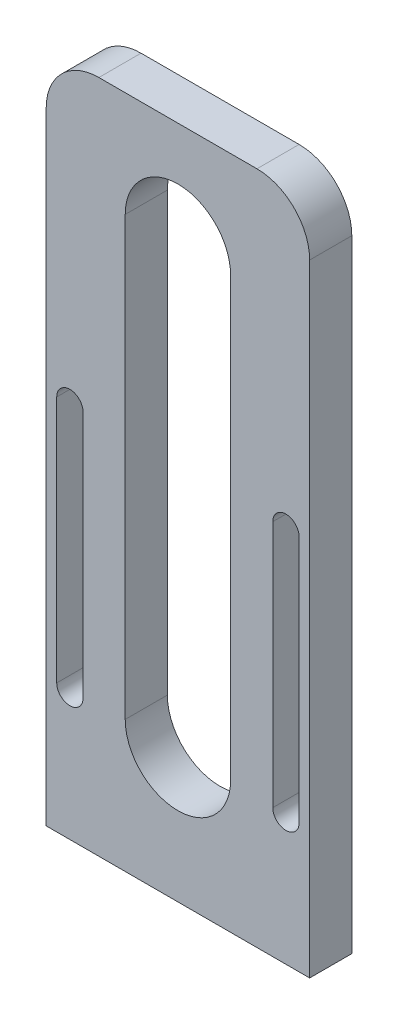
ISO-10303-21;
HEADER;
FILE_DESCRIPTION(('STEP AP214'),'2;1');
FILE_NAME('part.step','',(''),(''),'','','');
FILE_SCHEMA(('AUTOMOTIVE_DESIGN { 1 0 10303 214 1 1 1 1 }'));
ENDSEC;
DATA;
#1=APPLICATION_CONTEXT('core data for automotive mechanical design processes');
#2=APPLICATION_PROTOCOL_DEFINITION('international standard','automotive_design',2000,#1);
#3=PRODUCT_CONTEXT('',#1,'mechanical');
#4=PRODUCT('Part','Part','',(#3));
#5=PRODUCT_RELATED_PRODUCT_CATEGORY('part','',(#4));
#6=PRODUCT_DEFINITION_FORMATION('','',#4);
#7=PRODUCT_DEFINITION_CONTEXT('part definition',#1,'design');
#8=PRODUCT_DEFINITION('design','',#6,#7);
#9=PRODUCT_DEFINITION_SHAPE('','',#8);
#10=(LENGTH_UNIT() NAMED_UNIT(*) SI_UNIT(.MILLI.,.METRE.));
#11=(NAMED_UNIT(*) PLANE_ANGLE_UNIT() SI_UNIT($,.RADIAN.));
#12=(NAMED_UNIT(*) SI_UNIT($,.STERADIAN.) SOLID_ANGLE_UNIT());
#13=UNCERTAINTY_MEASURE_WITH_UNIT(LENGTH_MEASURE(1.E-05),#10,'distance_accuracy_value','');
#14=(GEOMETRIC_REPRESENTATION_CONTEXT(3) GLOBAL_UNCERTAINTY_ASSIGNED_CONTEXT((#13)) GLOBAL_UNIT_ASSIGNED_CONTEXT((#10,
#11,#12)) REPRESENTATION_CONTEXT('',''));
#15=CARTESIAN_POINT('',(0.,0.,0.));
#16=DIRECTION('',(0.,0.,1.));
#17=DIRECTION('',(1.,0.,0.));
#18=AXIS2_PLACEMENT_3D('',#15,#16,#17);
#19=CARTESIAN_POINT('',(-7.5,59.,4.));
#20=DIRECTION('',(0.,0.,-1.));
#21=DIRECTION('',(-1.,0.,0.));
#22=AXIS2_PLACEMENT_3D('',#19,#20,#21);
#23=PLANE('',#22);
#24=CARTESIAN_POINT('',(-10.25,35.75,4.));
#25=DIRECTION('',(0.,0.,1.));
#26=DIRECTION('',(1.,0.,0.));
#27=AXIS2_PLACEMENT_3D('',#24,#25,#26);
#28=CIRCLE('',#27,1.25);
#29=CARTESIAN_POINT('',(-9.,35.75,4.));
#30=VERTEX_POINT('',#29);
#31=CARTESIAN_POINT('',(-11.5,35.75,4.));
#32=VERTEX_POINT('',#31);
#33=EDGE_CURVE('E195',#30,#32,#28,.T.);
#34=ORIENTED_EDGE('',*,*,#33,.F.);
#35=DIRECTION('',(0.,1.,0.));
#36=VECTOR('',#35,1.);
#37=CARTESIAN_POINT('',(-9.,35.75,4.));
#38=LINE('',#37,#36);
#39=CARTESIAN_POINT('',(-8.99999999999999,12.25,4.));
#40=VERTEX_POINT('',#39);
#41=EDGE_CURVE('E203',#40,#30,#38,.T.);
#42=ORIENTED_EDGE('',*,*,#41,.F.);
#43=CARTESIAN_POINT('',(-10.25,12.25,4.));
#44=DIRECTION('',(0.,0.,1.));
#45=DIRECTION('',(1.,0.,0.));
#46=AXIS2_PLACEMENT_3D('',#43,#44,#45);
#47=CIRCLE('',#46,1.25);
#48=CARTESIAN_POINT('',(-11.5,12.25,4.));
#49=VERTEX_POINT('',#48);
#50=EDGE_CURVE('E200',#49,#40,#47,.T.);
#51=ORIENTED_EDGE('',*,*,#50,.F.);
#52=DIRECTION('',(0.,-1.,0.));
#53=VECTOR('',#52,1.);
#54=CARTESIAN_POINT('',(-11.5,35.75,4.));
#55=LINE('',#54,#53);
#56=EDGE_CURVE('E197',#32,#49,#55,.T.);
#57=ORIENTED_EDGE('',*,*,#56,.F.);
#58=EDGE_LOOP('',(#34,#42,#51,#57));
#59=FACE_BOUND('',#58,.T.);
#60=DIRECTION('',(0.,-1.,0.));
#61=VECTOR('',#60,1.);
#62=CARTESIAN_POINT('',(-12.5,0.,4.));
#63=LINE('',#62,#61);
#64=CARTESIAN_POINT('',(-12.5,59.,4.));
#65=VERTEX_POINT('',#64);
#66=CARTESIAN_POINT('',(-12.5,0.,4.));
#67=VERTEX_POINT('',#66);
#68=EDGE_CURVE('E257',#65,#67,#63,.T.);
#69=ORIENTED_EDGE('',*,*,#68,.T.);
#70=DIRECTION('',(1.,0.,0.));
#71=VECTOR('',#70,1.);
#72=CARTESIAN_POINT('',(-12.5,0.,4.));
#73=LINE('',#72,#71);
#74=CARTESIAN_POINT('',(12.5,0.,4.));
#75=VERTEX_POINT('',#74);
#76=EDGE_CURVE('E260',#67,#75,#73,.T.);
#77=ORIENTED_EDGE('',*,*,#76,.T.);
#78=DIRECTION('',(0.,1.,0.));
#79=VECTOR('',#78,1.);
#80=CARTESIAN_POINT('',(12.5,0.,4.));
#81=LINE('',#80,#79);
#82=CARTESIAN_POINT('',(12.5,59.,4.));
#83=VERTEX_POINT('',#82);
#84=EDGE_CURVE('E263',#75,#83,#81,.T.);
#85=ORIENTED_EDGE('',*,*,#84,.T.);
#86=CARTESIAN_POINT('',(7.5,59.,4.));
#87=DIRECTION('',(0.,0.,1.));
#88=DIRECTION('',(-1.,0.,0.));
#89=AXIS2_PLACEMENT_3D('',#86,#87,#88);
#90=CIRCLE('',#89,5.);
#91=CARTESIAN_POINT('',(7.49999999999997,64.,4.));
#92=VERTEX_POINT('',#91);
#93=EDGE_CURVE('E265',#83,#92,#90,.T.);
#94=ORIENTED_EDGE('',*,*,#93,.T.);
#95=DIRECTION('',(-1.,0.,0.));
#96=VECTOR('',#95,1.);
#97=CARTESIAN_POINT('',(-7.49999999999997,64.,4.));
#98=LINE('',#97,#96);
#99=CARTESIAN_POINT('',(-7.49999999999997,64.,4.));
#100=VERTEX_POINT('',#99);
#101=EDGE_CURVE('E267',#92,#100,#98,.T.);
#102=ORIENTED_EDGE('',*,*,#101,.T.);
#103=CARTESIAN_POINT('',(-7.5,59.,4.));
#104=DIRECTION('',(0.,0.,1.));
#105=DIRECTION('',(-1.,0.,0.));
#106=AXIS2_PLACEMENT_3D('',#103,#104,#105);
#107=CIRCLE('',#106,5.);
#108=EDGE_CURVE('E269',#100,#65,#107,.T.);
#109=ORIENTED_EDGE('',*,*,#108,.T.);
#110=EDGE_LOOP('',(#69,#77,#85,#94,#102,#109));
#111=FACE_BOUND('',#110,.T.);
#112=CARTESIAN_POINT('',(0.,54.,4.));
#113=DIRECTION('',(0.,0.,1.));
#114=DIRECTION('',(1.,0.,0.));
#115=AXIS2_PLACEMENT_3D('',#112,#113,#114);
#116=CIRCLE('',#115,5.);
#117=CARTESIAN_POINT('',(5.,54.,4.));
#118=VERTEX_POINT('',#117);
#119=CARTESIAN_POINT('',(-5.,54.,4.));
#120=VERTEX_POINT('',#119);
#121=EDGE_CURVE('E226',#118,#120,#116,.T.);
#122=ORIENTED_EDGE('',*,*,#121,.F.);
#123=DIRECTION('',(0.,1.,0.));
#124=VECTOR('',#123,1.);
#125=CARTESIAN_POINT('',(5.,54.,4.));
#126=LINE('',#125,#124);
#127=CARTESIAN_POINT('',(4.99999999999999,12.5,4.));
#128=VERTEX_POINT('',#127);
#129=EDGE_CURVE('E234',#128,#118,#126,.T.);
#130=ORIENTED_EDGE('',*,*,#129,.F.);
#131=CARTESIAN_POINT('',(0.,12.5,4.));
#132=DIRECTION('',(0.,0.,1.));
#133=DIRECTION('',(1.,0.,0.));
#134=AXIS2_PLACEMENT_3D('',#131,#132,#133);
#135=CIRCLE('',#134,4.99999999999999);
#136=CARTESIAN_POINT('',(-4.99999999999999,12.5,4.));
#137=VERTEX_POINT('',#136);
#138=EDGE_CURVE('E231',#137,#128,#135,.T.);
#139=ORIENTED_EDGE('',*,*,#138,.F.);
#140=DIRECTION('',(0.,-1.,0.));
#141=VECTOR('',#140,1.);
#142=CARTESIAN_POINT('',(-5.,54.,4.));
#143=LINE('',#142,#141);
#144=EDGE_CURVE('E228',#120,#137,#143,.T.);
#145=ORIENTED_EDGE('',*,*,#144,.F.);
#146=EDGE_LOOP('',(#122,#130,#139,#145));
#147=FACE_BOUND('',#146,.T.);
#148=CARTESIAN_POINT('',(10.25,35.75,4.));
#149=DIRECTION('',(0.,0.,1.));
#150=DIRECTION('',(-1.,0.,0.));
#151=AXIS2_PLACEMENT_3D('',#148,#149,#150);
#152=CIRCLE('',#151,1.25);
#153=CARTESIAN_POINT('',(11.5,35.75,4.));
#154=VERTEX_POINT('',#153);
#155=CARTESIAN_POINT('',(9.,35.75,4.));
#156=VERTEX_POINT('',#155);
#157=EDGE_CURVE('E159',#154,#156,#152,.T.);
#158=ORIENTED_EDGE('',*,*,#157,.F.);
#159=DIRECTION('',(0.,1.,0.));
#160=VECTOR('',#159,1.);
#161=CARTESIAN_POINT('',(11.5,35.75,4.));
#162=LINE('',#161,#160);
#163=CARTESIAN_POINT('',(11.5,12.25,4.));
#164=VERTEX_POINT('',#163);
#165=EDGE_CURVE('E181',#164,#154,#162,.T.);
#166=ORIENTED_EDGE('',*,*,#165,.F.);
#167=CARTESIAN_POINT('',(10.25,12.25,4.));
#168=DIRECTION('',(0.,0.,1.));
#169=DIRECTION('',(-1.,0.,0.));
#170=AXIS2_PLACEMENT_3D('',#167,#168,#169);
#171=CIRCLE('',#170,1.25);
#172=CARTESIAN_POINT('',(8.99999999999999,12.25,4.));
#173=VERTEX_POINT('',#172);
#174=EDGE_CURVE('E179',#173,#164,#171,.T.);
#175=ORIENTED_EDGE('',*,*,#174,.F.);
#176=DIRECTION('',(0.,-1.,0.));
#177=VECTOR('',#176,1.);
#178=CARTESIAN_POINT('',(9.,35.75,4.));
#179=LINE('',#178,#177);
#180=EDGE_CURVE('E167',#156,#173,#179,.T.);
#181=ORIENTED_EDGE('',*,*,#180,.F.);
#182=EDGE_LOOP('',(#158,#166,#175,#181));
#183=FACE_BOUND('',#182,.T.);
#184=ADVANCED_FACE('F34',(#59,#111,#147,#183),#23,.F.);
#185=CARTESIAN_POINT('',(-7.5,59.,0.));
#186=DIRECTION('',(0.,0.,-1.));
#187=DIRECTION('',(-1.,0.,0.));
#188=AXIS2_PLACEMENT_3D('',#185,#186,#187);
#189=PLANE('',#188);
#190=DIRECTION('',(0.,-1.,0.));
#191=VECTOR('',#190,1.);
#192=CARTESIAN_POINT('',(-12.5,0.,0.));
#193=LINE('',#192,#191);
#194=CARTESIAN_POINT('',(-12.5,59.,0.));
#195=VERTEX_POINT('',#194);
#196=CARTESIAN_POINT('',(-12.5,0.,0.));
#197=VERTEX_POINT('',#196);
#198=EDGE_CURVE('E256',#195,#197,#193,.T.);
#199=ORIENTED_EDGE('',*,*,#198,.F.);
#200=CARTESIAN_POINT('',(-7.5,59.,0.));
#201=DIRECTION('',(0.,0.,1.));
#202=DIRECTION('',(-1.,0.,0.));
#203=AXIS2_PLACEMENT_3D('',#200,#201,#202);
#204=CIRCLE('',#203,5.);
#205=CARTESIAN_POINT('',(-7.49999999999997,64.,0.));
#206=VERTEX_POINT('',#205);
#207=EDGE_CURVE('E261',#206,#195,#204,.T.);
#208=ORIENTED_EDGE('',*,*,#207,.F.);
#209=DIRECTION('',(-1.,0.,0.));
#210=VECTOR('',#209,1.);
#211=CARTESIAN_POINT('',(-7.49999999999997,64.,0.));
#212=LINE('',#211,#210);
#213=CARTESIAN_POINT('',(7.49999999999997,64.,0.));
#214=VERTEX_POINT('',#213);
#215=EDGE_CURVE('E280',#214,#206,#212,.T.);
#216=ORIENTED_EDGE('',*,*,#215,.F.);
#217=CARTESIAN_POINT('',(7.5,59.,0.));
#218=DIRECTION('',(0.,0.,1.));
#219=DIRECTION('',(-1.,0.,0.));
#220=AXIS2_PLACEMENT_3D('',#217,#218,#219);
#221=CIRCLE('',#220,5.);
#222=CARTESIAN_POINT('',(12.5,59.,0.));
#223=VERTEX_POINT('',#222);
#224=EDGE_CURVE('E278',#223,#214,#221,.T.);
#225=ORIENTED_EDGE('',*,*,#224,.F.);
#226=DIRECTION('',(0.,1.,0.));
#227=VECTOR('',#226,1.);
#228=CARTESIAN_POINT('',(12.5,0.,0.));
#229=LINE('',#228,#227);
#230=CARTESIAN_POINT('',(12.5,0.,0.));
#231=VERTEX_POINT('',#230);
#232=EDGE_CURVE('E276',#231,#223,#229,.T.);
#233=ORIENTED_EDGE('',*,*,#232,.F.);
#234=DIRECTION('',(1.,0.,0.));
#235=VECTOR('',#234,1.);
#236=CARTESIAN_POINT('',(-12.5,0.,0.));
#237=LINE('',#236,#235);
#238=EDGE_CURVE('E274',#197,#231,#237,.T.);
#239=ORIENTED_EDGE('',*,*,#238,.F.);
#240=EDGE_LOOP('',(#199,#208,#216,#225,#233,#239));
#241=FACE_BOUND('',#240,.T.);
#242=DIRECTION('',(0.,1.,0.));
#243=VECTOR('',#242,1.);
#244=CARTESIAN_POINT('',(5.,54.,0.));
#245=LINE('',#244,#243);
#246=CARTESIAN_POINT('',(4.99999999999999,12.5,0.));
#247=VERTEX_POINT('',#246);
#248=CARTESIAN_POINT('',(5.,54.,0.));
#249=VERTEX_POINT('',#248);
#250=EDGE_CURVE('E229',#247,#249,#245,.T.);
#251=ORIENTED_EDGE('',*,*,#250,.T.);
#252=CARTESIAN_POINT('',(0.,54.,0.));
#253=DIRECTION('',(0.,0.,1.));
#254=DIRECTION('',(1.,0.,0.));
#255=AXIS2_PLACEMENT_3D('',#252,#253,#254);
#256=CIRCLE('',#255,5.);
#257=CARTESIAN_POINT('',(-5.,54.,0.));
#258=VERTEX_POINT('',#257);
#259=EDGE_CURVE('E225',#249,#258,#256,.T.);
#260=ORIENTED_EDGE('',*,*,#259,.T.);
#261=DIRECTION('',(0.,-1.,0.));
#262=VECTOR('',#261,1.);
#263=CARTESIAN_POINT('',(-5.,54.,0.));
#264=LINE('',#263,#262);
#265=CARTESIAN_POINT('',(-4.99999999999999,12.5,0.));
#266=VERTEX_POINT('',#265);
#267=EDGE_CURVE('E239',#258,#266,#264,.T.);
#268=ORIENTED_EDGE('',*,*,#267,.T.);
#269=CARTESIAN_POINT('',(0.,12.5,0.));
#270=DIRECTION('',(0.,0.,1.));
#271=DIRECTION('',(1.,0.,0.));
#272=AXIS2_PLACEMENT_3D('',#269,#270,#271);
#273=CIRCLE('',#272,4.99999999999999);
#274=EDGE_CURVE('E242',#266,#247,#273,.T.);
#275=ORIENTED_EDGE('',*,*,#274,.T.);
#276=EDGE_LOOP('',(#251,#260,#268,#275));
#277=FACE_BOUND('',#276,.T.);
#278=DIRECTION('',(0.,1.,0.));
#279=VECTOR('',#278,1.);
#280=CARTESIAN_POINT('',(-9.,35.75,0.));
#281=LINE('',#280,#279);
#282=CARTESIAN_POINT('',(-8.99999999999999,12.25,0.));
#283=VERTEX_POINT('',#282);
#284=CARTESIAN_POINT('',(-9.,35.75,0.));
#285=VERTEX_POINT('',#284);
#286=EDGE_CURVE('E198',#283,#285,#281,.T.);
#287=ORIENTED_EDGE('',*,*,#286,.T.);
#288=CARTESIAN_POINT('',(-10.25,35.75,0.));
#289=DIRECTION('',(0.,0.,1.));
#290=DIRECTION('',(1.,0.,0.));
#291=AXIS2_PLACEMENT_3D('',#288,#289,#290);
#292=CIRCLE('',#291,1.25);
#293=CARTESIAN_POINT('',(-11.5,35.75,0.));
#294=VERTEX_POINT('',#293);
#295=EDGE_CURVE('E175',#285,#294,#292,.T.);
#296=ORIENTED_EDGE('',*,*,#295,.T.);
#297=DIRECTION('',(0.,-1.,0.));
#298=VECTOR('',#297,1.);
#299=CARTESIAN_POINT('',(-11.5,35.75,0.));
#300=LINE('',#299,#298);
#301=CARTESIAN_POINT('',(-11.5,12.25,0.));
#302=VERTEX_POINT('',#301);
#303=EDGE_CURVE('E208',#294,#302,#300,.T.);
#304=ORIENTED_EDGE('',*,*,#303,.T.);
#305=CARTESIAN_POINT('',(-10.25,12.25,0.));
#306=DIRECTION('',(0.,0.,1.));
#307=DIRECTION('',(1.,0.,0.));
#308=AXIS2_PLACEMENT_3D('',#305,#306,#307);
#309=CIRCLE('',#308,1.25);
#310=EDGE_CURVE('E211',#302,#283,#309,.T.);
#311=ORIENTED_EDGE('',*,*,#310,.T.);
#312=EDGE_LOOP('',(#287,#296,#304,#311));
#313=FACE_BOUND('',#312,.T.);
#314=DIRECTION('',(0.,1.,0.));
#315=VECTOR('',#314,1.);
#316=CARTESIAN_POINT('',(11.5,35.75,0.));
#317=LINE('',#316,#315);
#318=CARTESIAN_POINT('',(11.5,12.25,0.));
#319=VERTEX_POINT('',#318);
#320=CARTESIAN_POINT('',(11.5,35.75,0.));
#321=VERTEX_POINT('',#320);
#322=EDGE_CURVE('E168',#319,#321,#317,.T.);
#323=ORIENTED_EDGE('',*,*,#322,.T.);
#324=CARTESIAN_POINT('',(10.25,35.75,0.));
#325=DIRECTION('',(0.,0.,1.));
#326=DIRECTION('',(-1.,0.,0.));
#327=AXIS2_PLACEMENT_3D('',#324,#325,#326);
#328=CIRCLE('',#327,1.25);
#329=CARTESIAN_POINT('',(9.,35.75,0.));
#330=VERTEX_POINT('',#329);
#331=EDGE_CURVE('E57',#321,#330,#328,.T.);
#332=ORIENTED_EDGE('',*,*,#331,.T.);
#333=DIRECTION('',(0.,-1.,0.));
#334=VECTOR('',#333,1.);
#335=CARTESIAN_POINT('',(9.,35.75,0.));
#336=LINE('',#335,#334);
#337=CARTESIAN_POINT('',(8.99999999999999,12.25,0.));
#338=VERTEX_POINT('',#337);
#339=EDGE_CURVE('E174',#330,#338,#336,.T.);
#340=ORIENTED_EDGE('',*,*,#339,.T.);
#341=CARTESIAN_POINT('',(10.25,12.25,0.));
#342=DIRECTION('',(0.,0.,1.));
#343=DIRECTION('',(-1.,0.,0.));
#344=AXIS2_PLACEMENT_3D('',#341,#342,#343);
#345=CIRCLE('',#344,1.25);
#346=EDGE_CURVE('E187',#338,#319,#345,.T.);
#347=ORIENTED_EDGE('',*,*,#346,.T.);
#348=EDGE_LOOP('',(#323,#332,#340,#347));
#349=FACE_BOUND('',#348,.T.);
#350=ADVANCED_FACE('F304',(#241,#277,#313,#349),#189,.T.);
#351=CARTESIAN_POINT('',(-12.5,0.,4.));
#352=DIRECTION('',(1.,0.,0.));
#353=DIRECTION('',(0.,0.,-1.));
#354=AXIS2_PLACEMENT_3D('',#351,#352,#353);
#355=PLANE('',#354);
#356=ORIENTED_EDGE('',*,*,#198,.T.);
#357=DIRECTION('',(0.,0.,-1.));
#358=VECTOR('',#357,1.);
#359=CARTESIAN_POINT('',(-12.5,0.,4.));
#360=LINE('',#359,#358);
#361=EDGE_CURVE('E11',#67,#197,#360,.T.);
#362=ORIENTED_EDGE('',*,*,#361,.F.);
#363=ORIENTED_EDGE('',*,*,#68,.F.);
#364=DIRECTION('',(0.,0.,-1.));
#365=VECTOR('',#364,1.);
#366=CARTESIAN_POINT('',(-12.5,59.,4.));
#367=LINE('',#366,#365);
#368=EDGE_CURVE('E271',#65,#195,#367,.T.);
#369=ORIENTED_EDGE('',*,*,#368,.T.);
#370=EDGE_LOOP('',(#356,#362,#363,#369));
#371=FACE_BOUND('',#370,.T.);
#372=ADVANCED_FACE('F36',(#371),#355,.F.);
#373=CARTESIAN_POINT('',(-12.5,0.,4.));
#374=DIRECTION('',(0.,1.,0.));
#375=DIRECTION('',(0.,0.,1.));
#376=AXIS2_PLACEMENT_3D('',#373,#374,#375);
#377=PLANE('',#376);
#378=ORIENTED_EDGE('',*,*,#238,.T.);
#379=DIRECTION('',(0.,0.,-1.));
#380=VECTOR('',#379,1.);
#381=CARTESIAN_POINT('',(12.5,0.,4.));
#382=LINE('',#381,#380);
#383=EDGE_CURVE('E42',#75,#231,#382,.T.);
#384=ORIENTED_EDGE('',*,*,#383,.F.);
#385=ORIENTED_EDGE('',*,*,#76,.F.);
#386=ORIENTED_EDGE('',*,*,#361,.T.);
#387=EDGE_LOOP('',(#378,#384,#385,#386));
#388=FACE_BOUND('',#387,.T.);
#389=ADVANCED_FACE('F322',(#388),#377,.F.);
#390=CARTESIAN_POINT('',(12.5,0.,4.));
#391=DIRECTION('',(-1.,0.,0.));
#392=DIRECTION('',(0.,0.,1.));
#393=AXIS2_PLACEMENT_3D('',#390,#391,#392);
#394=PLANE('',#393);
#395=ORIENTED_EDGE('',*,*,#232,.T.);
#396=DIRECTION('',(0.,0.,-1.));
#397=VECTOR('',#396,1.);
#398=CARTESIAN_POINT('',(12.5,59.,4.));
#399=LINE('',#398,#397);
#400=EDGE_CURVE('E291',#83,#223,#399,.T.);
#401=ORIENTED_EDGE('',*,*,#400,.F.);
#402=ORIENTED_EDGE('',*,*,#84,.F.);
#403=ORIENTED_EDGE('',*,*,#383,.T.);
#404=EDGE_LOOP('',(#395,#401,#402,#403));
#405=FACE_BOUND('',#404,.T.);
#406=ADVANCED_FACE('F298',(#405),#394,.F.);
#407=CARTESIAN_POINT('',(7.5,59.,4.));
#408=DIRECTION('',(0.,0.,-1.));
#409=DIRECTION('',(-1.,0.,0.));
#410=AXIS2_PLACEMENT_3D('',#407,#408,#409);
#411=CYLINDRICAL_SURFACE('',#410,5.);
#412=ORIENTED_EDGE('',*,*,#224,.T.);
#413=DIRECTION('',(0.,0.,-1.));
#414=VECTOR('',#413,1.);
#415=CARTESIAN_POINT('',(7.49999999999997,64.,4.));
#416=LINE('',#415,#414);
#417=EDGE_CURVE('E288',#92,#214,#416,.T.);
#418=ORIENTED_EDGE('',*,*,#417,.F.);
#419=ORIENTED_EDGE('',*,*,#93,.F.);
#420=ORIENTED_EDGE('',*,*,#400,.T.);
#421=EDGE_LOOP('',(#412,#418,#419,#420));
#422=FACE_BOUND('',#421,.T.);
#423=ADVANCED_FACE('F310',(#422),#411,.T.);
#424=CARTESIAN_POINT('',(-7.49999999999997,64.,4.));
#425=DIRECTION('',(0.,-1.,0.));
#426=DIRECTION('',(0.,0.,-1.));
#427=AXIS2_PLACEMENT_3D('',#424,#425,#426);
#428=PLANE('',#427);
#429=ORIENTED_EDGE('',*,*,#215,.T.);
#430=DIRECTION('',(0.,0.,-1.));
#431=VECTOR('',#430,1.);
#432=CARTESIAN_POINT('',(-7.49999999999997,64.,4.));
#433=LINE('',#432,#431);
#434=EDGE_CURVE('E285',#100,#206,#433,.T.);
#435=ORIENTED_EDGE('',*,*,#434,.F.);
#436=ORIENTED_EDGE('',*,*,#101,.F.);
#437=ORIENTED_EDGE('',*,*,#417,.T.);
#438=EDGE_LOOP('',(#429,#435,#436,#437));
#439=FACE_BOUND('',#438,.T.);
#440=ADVANCED_FACE('F314',(#439),#428,.F.);
#441=CARTESIAN_POINT('',(-7.5,59.,4.));
#442=DIRECTION('',(0.,0.,-1.));
#443=DIRECTION('',(-1.,0.,0.));
#444=AXIS2_PLACEMENT_3D('',#441,#442,#443);
#445=CYLINDRICAL_SURFACE('',#444,5.);
#446=ORIENTED_EDGE('',*,*,#207,.T.);
#447=ORIENTED_EDGE('',*,*,#368,.F.);
#448=ORIENTED_EDGE('',*,*,#108,.F.);
#449=ORIENTED_EDGE('',*,*,#434,.T.);
#450=EDGE_LOOP('',(#446,#447,#448,#449));
#451=FACE_BOUND('',#450,.T.);
#452=ADVANCED_FACE('F325',(#451),#445,.T.);
#453=CARTESIAN_POINT('',(0.,54.,4.));
#454=DIRECTION('',(0.,0.,-1.));
#455=DIRECTION('',(-1.,0.,0.));
#456=AXIS2_PLACEMENT_3D('',#453,#454,#455);
#457=CYLINDRICAL_SURFACE('',#456,5.);
#458=ORIENTED_EDGE('',*,*,#259,.F.);
#459=DIRECTION('',(0.,0.,-1.));
#460=VECTOR('',#459,1.);
#461=CARTESIAN_POINT('',(5.,54.,4.));
#462=LINE('',#461,#460);
#463=EDGE_CURVE('E236',#118,#249,#462,.T.);
#464=ORIENTED_EDGE('',*,*,#463,.F.);
#465=ORIENTED_EDGE('',*,*,#121,.T.);
#466=DIRECTION('',(0.,0.,-1.));
#467=VECTOR('',#466,1.);
#468=CARTESIAN_POINT('',(-5.,54.,4.));
#469=LINE('',#468,#467);
#470=EDGE_CURVE('E253',#120,#258,#469,.T.);
#471=ORIENTED_EDGE('',*,*,#470,.T.);
#472=EDGE_LOOP('',(#458,#464,#465,#471));
#473=FACE_BOUND('',#472,.T.);
#474=ADVANCED_FACE('F327',(#473),#457,.F.);
#475=CARTESIAN_POINT('',(-5.,54.,4.));
#476=DIRECTION('',(1.,0.,0.));
#477=DIRECTION('',(0.,1.,0.));
#478=AXIS2_PLACEMENT_3D('',#475,#476,#477);
#479=PLANE('',#478);
#480=ORIENTED_EDGE('',*,*,#267,.F.);
#481=ORIENTED_EDGE('',*,*,#470,.F.);
#482=ORIENTED_EDGE('',*,*,#144,.T.);
#483=DIRECTION('',(0.,0.,-1.));
#484=VECTOR('',#483,1.);
#485=CARTESIAN_POINT('',(-4.99999999999999,12.5,4.));
#486=LINE('',#485,#484);
#487=EDGE_CURVE('E251',#137,#266,#486,.T.);
#488=ORIENTED_EDGE('',*,*,#487,.T.);
#489=EDGE_LOOP('',(#480,#481,#482,#488));
#490=FACE_BOUND('',#489,.T.);
#491=ADVANCED_FACE('F333',(#490),#479,.T.);
#492=CARTESIAN_POINT('',(0.,12.5,4.));
#493=DIRECTION('',(0.,0.,-1.));
#494=DIRECTION('',(-1.,0.,0.));
#495=AXIS2_PLACEMENT_3D('',#492,#493,#494);
#496=CYLINDRICAL_SURFACE('',#495,4.99999999999999);
#497=ORIENTED_EDGE('',*,*,#274,.F.);
#498=ORIENTED_EDGE('',*,*,#487,.F.);
#499=ORIENTED_EDGE('',*,*,#138,.T.);
#500=DIRECTION('',(0.,0.,-1.));
#501=VECTOR('',#500,1.);
#502=CARTESIAN_POINT('',(4.99999999999999,12.5,4.));
#503=LINE('',#502,#501);
#504=EDGE_CURVE('E249',#128,#247,#503,.T.);
#505=ORIENTED_EDGE('',*,*,#504,.T.);
#506=EDGE_LOOP('',(#497,#498,#499,#505));
#507=FACE_BOUND('',#506,.T.);
#508=ADVANCED_FACE('F348',(#507),#496,.F.);
#509=CARTESIAN_POINT('',(5.,54.,4.));
#510=DIRECTION('',(-1.,0.,0.));
#511=DIRECTION('',(0.,-1.,0.));
#512=AXIS2_PLACEMENT_3D('',#509,#510,#511);
#513=PLANE('',#512);
#514=ORIENTED_EDGE('',*,*,#250,.F.);
#515=ORIENTED_EDGE('',*,*,#504,.F.);
#516=ORIENTED_EDGE('',*,*,#129,.T.);
#517=ORIENTED_EDGE('',*,*,#463,.T.);
#518=EDGE_LOOP('',(#514,#515,#516,#517));
#519=FACE_BOUND('',#518,.T.);
#520=ADVANCED_FACE('F352',(#519),#513,.T.);
#521=CARTESIAN_POINT('',(-10.25,35.75,4.));
#522=DIRECTION('',(0.,0.,-1.));
#523=DIRECTION('',(-1.,0.,0.));
#524=AXIS2_PLACEMENT_3D('',#521,#522,#523);
#525=CYLINDRICAL_SURFACE('',#524,1.25);
#526=ORIENTED_EDGE('',*,*,#295,.F.);
#527=DIRECTION('',(0.,0.,-1.));
#528=VECTOR('',#527,1.);
#529=CARTESIAN_POINT('',(-9.,35.75,4.));
#530=LINE('',#529,#528);
#531=EDGE_CURVE('E205',#30,#285,#530,.T.);
#532=ORIENTED_EDGE('',*,*,#531,.F.);
#533=ORIENTED_EDGE('',*,*,#33,.T.);
#534=DIRECTION('',(0.,0.,-1.));
#535=VECTOR('',#534,1.);
#536=CARTESIAN_POINT('',(-11.5,35.75,4.));
#537=LINE('',#536,#535);
#538=EDGE_CURVE('E222',#32,#294,#537,.T.);
#539=ORIENTED_EDGE('',*,*,#538,.T.);
#540=EDGE_LOOP('',(#526,#532,#533,#539));
#541=FACE_BOUND('',#540,.T.);
#542=ADVANCED_FACE('F356',(#541),#525,.F.);
#543=CARTESIAN_POINT('',(-11.5,35.75,4.));
#544=DIRECTION('',(1.,0.,0.));
#545=DIRECTION('',(0.,1.,0.));
#546=AXIS2_PLACEMENT_3D('',#543,#544,#545);
#547=PLANE('',#546);
#548=ORIENTED_EDGE('',*,*,#303,.F.);
#549=ORIENTED_EDGE('',*,*,#538,.F.);
#550=ORIENTED_EDGE('',*,*,#56,.T.);
#551=DIRECTION('',(0.,0.,-1.));
#552=VECTOR('',#551,1.);
#553=CARTESIAN_POINT('',(-11.5,12.25,4.));
#554=LINE('',#553,#552);
#555=EDGE_CURVE('E220',#49,#302,#554,.T.);
#556=ORIENTED_EDGE('',*,*,#555,.T.);
#557=EDGE_LOOP('',(#548,#549,#550,#556));
#558=FACE_BOUND('',#557,.T.);
#559=ADVANCED_FACE('F360',(#558),#547,.T.);
#560=CARTESIAN_POINT('',(-10.25,12.25,4.));
#561=DIRECTION('',(0.,0.,-1.));
#562=DIRECTION('',(-1.,0.,0.));
#563=AXIS2_PLACEMENT_3D('',#560,#561,#562);
#564=CYLINDRICAL_SURFACE('',#563,1.25);
#565=ORIENTED_EDGE('',*,*,#310,.F.);
#566=ORIENTED_EDGE('',*,*,#555,.F.);
#567=ORIENTED_EDGE('',*,*,#50,.T.);
#568=DIRECTION('',(0.,0.,-1.));
#569=VECTOR('',#568,1.);
#570=CARTESIAN_POINT('',(-8.99999999999999,12.25,4.));
#571=LINE('',#570,#569);
#572=EDGE_CURVE('E218',#40,#283,#571,.T.);
#573=ORIENTED_EDGE('',*,*,#572,.T.);
#574=EDGE_LOOP('',(#565,#566,#567,#573));
#575=FACE_BOUND('',#574,.T.);
#576=ADVANCED_FACE('F364',(#575),#564,.F.);
#577=CARTESIAN_POINT('',(-9.,35.75,4.));
#578=DIRECTION('',(-1.,0.,0.));
#579=DIRECTION('',(0.,-1.,0.));
#580=AXIS2_PLACEMENT_3D('',#577,#578,#579);
#581=PLANE('',#580);
#582=ORIENTED_EDGE('',*,*,#286,.F.);
#583=ORIENTED_EDGE('',*,*,#572,.F.);
#584=ORIENTED_EDGE('',*,*,#41,.T.);
#585=ORIENTED_EDGE('',*,*,#531,.T.);
#586=EDGE_LOOP('',(#582,#583,#584,#585));
#587=FACE_BOUND('',#586,.T.);
#588=ADVANCED_FACE('F368',(#587),#581,.T.);
#589=CARTESIAN_POINT('',(10.25,35.75,4.));
#590=DIRECTION('',(0.,0.,-1.));
#591=DIRECTION('',(-1.,0.,0.));
#592=AXIS2_PLACEMENT_3D('',#589,#590,#591);
#593=CYLINDRICAL_SURFACE('',#592,1.25);
#594=ORIENTED_EDGE('',*,*,#331,.F.);
#595=DIRECTION('',(0.,0.,-1.));
#596=VECTOR('',#595,1.);
#597=CARTESIAN_POINT('',(11.5,35.75,4.));
#598=LINE('',#597,#596);
#599=EDGE_CURVE('E163',#154,#321,#598,.T.);
#600=ORIENTED_EDGE('',*,*,#599,.F.);
#601=ORIENTED_EDGE('',*,*,#157,.T.);
#602=DIRECTION('',(0.,0.,-1.));
#603=VECTOR('',#602,1.);
#604=CARTESIAN_POINT('',(9.,35.75,4.));
#605=LINE('',#604,#603);
#606=EDGE_CURVE('E162',#156,#330,#605,.T.);
#607=ORIENTED_EDGE('',*,*,#606,.T.);
#608=EDGE_LOOP('',(#594,#600,#601,#607));
#609=FACE_BOUND('',#608,.T.);
#610=ADVANCED_FACE('F161',(#609),#593,.F.);
#611=CARTESIAN_POINT('',(9.,35.75,4.));
#612=DIRECTION('',(1.,0.,0.));
#613=DIRECTION('',(0.,1.,0.));
#614=AXIS2_PLACEMENT_3D('',#611,#612,#613);
#615=PLANE('',#614);
#616=ORIENTED_EDGE('',*,*,#339,.F.);
#617=ORIENTED_EDGE('',*,*,#606,.F.);
#618=ORIENTED_EDGE('',*,*,#180,.T.);
#619=DIRECTION('',(0.,0.,-1.));
#620=VECTOR('',#619,1.);
#621=CARTESIAN_POINT('',(8.99999999999999,12.25,4.));
#622=LINE('',#621,#620);
#623=EDGE_CURVE('E176',#173,#338,#622,.T.);
#624=ORIENTED_EDGE('',*,*,#623,.T.);
#625=EDGE_LOOP('',(#616,#617,#618,#624));
#626=FACE_BOUND('',#625,.T.);
#627=ADVANCED_FACE('F171',(#626),#615,.T.);
#628=CARTESIAN_POINT('',(10.25,12.25,4.));
#629=DIRECTION('',(0.,0.,-1.));
#630=DIRECTION('',(-1.,0.,0.));
#631=AXIS2_PLACEMENT_3D('',#628,#629,#630);
#632=CYLINDRICAL_SURFACE('',#631,1.25);
#633=ORIENTED_EDGE('',*,*,#346,.F.);
#634=ORIENTED_EDGE('',*,*,#623,.F.);
#635=ORIENTED_EDGE('',*,*,#174,.T.);
#636=DIRECTION('',(0.,0.,-1.));
#637=VECTOR('',#636,1.);
#638=CARTESIAN_POINT('',(11.5,12.25,4.));
#639=LINE('',#638,#637);
#640=EDGE_CURVE('E49',#164,#319,#639,.T.);
#641=ORIENTED_EDGE('',*,*,#640,.T.);
#642=EDGE_LOOP('',(#633,#634,#635,#641));
#643=FACE_BOUND('',#642,.T.);
#644=ADVANCED_FACE('F377',(#643),#632,.F.);
#645=CARTESIAN_POINT('',(11.5,35.75,4.));
#646=DIRECTION('',(-1.,0.,0.));
#647=DIRECTION('',(0.,-1.,0.));
#648=AXIS2_PLACEMENT_3D('',#645,#646,#647);
#649=PLANE('',#648);
#650=ORIENTED_EDGE('',*,*,#322,.F.);
#651=ORIENTED_EDGE('',*,*,#640,.F.);
#652=ORIENTED_EDGE('',*,*,#165,.T.);
#653=ORIENTED_EDGE('',*,*,#599,.T.);
#654=EDGE_LOOP('',(#650,#651,#652,#653));
#655=FACE_BOUND('',#654,.T.);
#656=ADVANCED_FACE('F380',(#655),#649,.T.);
#657=CLOSED_SHELL('',(#184,#350,#372,#389,#406,#423,#440,#452,#474,#491,#508,#520,#542,#559,
#576,#588,#610,#627,#644,#656));
#658=MANIFOLD_SOLID_BREP('B2',#657);
#659=ADVANCED_BREP_SHAPE_REPRESENTATION('',(#18,#658),#14);
#660=SHAPE_DEFINITION_REPRESENTATION(#9,#659);
ENDSEC;
END-ISO-10303-21;
